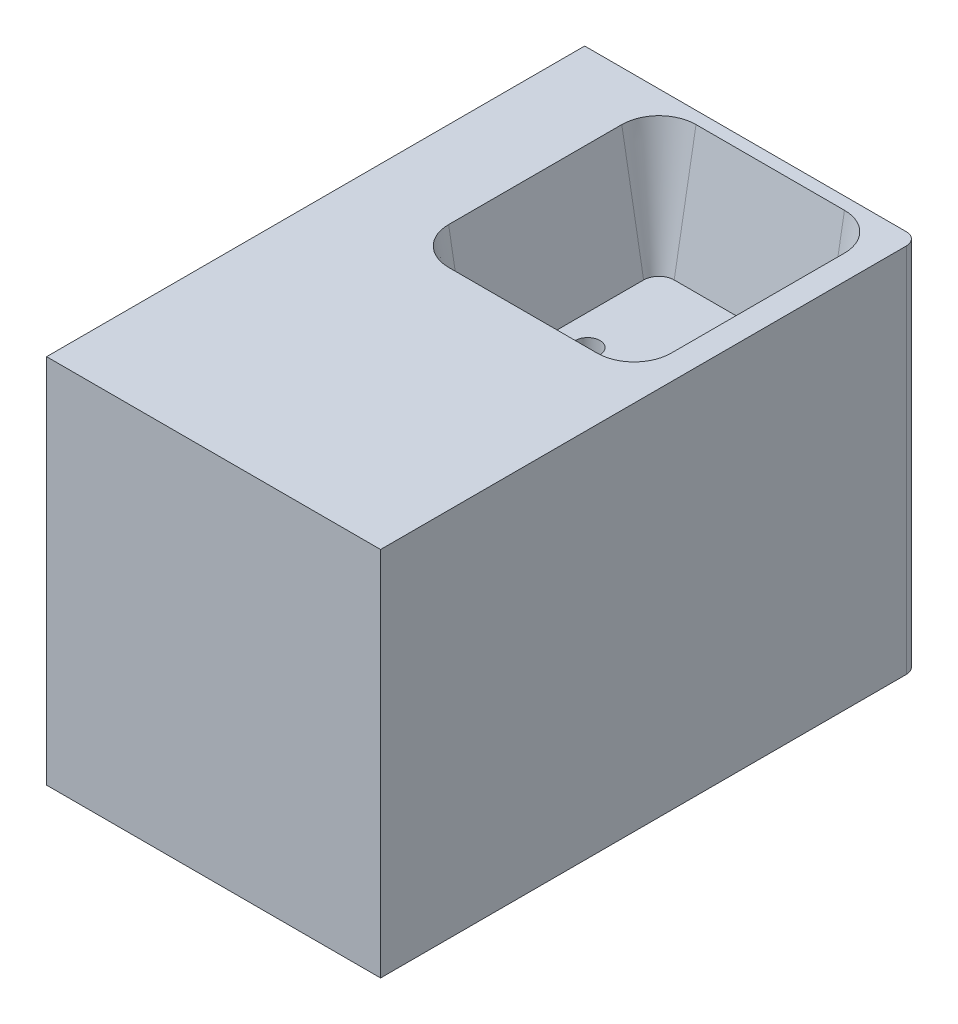
ISO-10303-21;
HEADER;
FILE_DESCRIPTION(('STEP AP214'),'2;1');
FILE_NAME('part.step','',(''),(''),'','','');
FILE_SCHEMA(('AUTOMOTIVE_DESIGN { 1 0 10303 214 1 1 1 1 }'));
ENDSEC;
DATA;
#1=APPLICATION_CONTEXT('core data for automotive mechanical design processes');
#2=APPLICATION_PROTOCOL_DEFINITION('international standard','automotive_design',2000,#1);
#3=PRODUCT_CONTEXT('',#1,'mechanical');
#4=PRODUCT('Part','Part','',(#3));
#5=PRODUCT_RELATED_PRODUCT_CATEGORY('part','',(#4));
#6=PRODUCT_DEFINITION_FORMATION('','',#4);
#7=PRODUCT_DEFINITION_CONTEXT('part definition',#1,'design');
#8=PRODUCT_DEFINITION('design','',#6,#7);
#9=PRODUCT_DEFINITION_SHAPE('','',#8);
#10=(LENGTH_UNIT() NAMED_UNIT(*) SI_UNIT(.MILLI.,.METRE.));
#11=(NAMED_UNIT(*) PLANE_ANGLE_UNIT() SI_UNIT($,.RADIAN.));
#12=(NAMED_UNIT(*) SI_UNIT($,.STERADIAN.) SOLID_ANGLE_UNIT());
#13=UNCERTAINTY_MEASURE_WITH_UNIT(LENGTH_MEASURE(1.E-05),#10,'distance_accuracy_value','');
#14=(GEOMETRIC_REPRESENTATION_CONTEXT(3) GLOBAL_UNCERTAINTY_ASSIGNED_CONTEXT((#13)) GLOBAL_UNIT_ASSIGNED_CONTEXT((#10,
#11,#12)) REPRESENTATION_CONTEXT('',''));
#15=CARTESIAN_POINT('',(0.,0.,0.));
#16=DIRECTION('',(0.,0.,1.));
#17=DIRECTION('',(1.,0.,0.));
#18=AXIS2_PLACEMENT_3D('',#15,#16,#17);
#19=CARTESIAN_POINT('',(-18.75,32.,-9.00000000000002));
#20=DIRECTION('',(0.,1.,0.));
#21=DIRECTION('',(0.,0.,1.));
#22=AXIS2_PLACEMENT_3D('',#19,#20,#21);
#23=CYLINDRICAL_SURFACE('',#22,1.);
#24=DIRECTION('',(0.,1.,0.));
#25=VECTOR('',#24,1.);
#26=CARTESIAN_POINT('',(-17.75,32.,-9.00000000000002));
#27=LINE('',#26,#25);
#28=CARTESIAN_POINT('',(-17.75,2.,-9.00000000000002));
#29=VERTEX_POINT('',#28);
#30=CARTESIAN_POINT('',(-17.75,32.,-9.00000000000002));
#31=VERTEX_POINT('',#30);
#32=EDGE_CURVE('E149',#29,#31,#27,.T.);
#33=ORIENTED_EDGE('',*,*,#32,.F.);
#34=CARTESIAN_POINT('',(-18.75,2.,-9.00000000000002));
#35=DIRECTION('',(0.,-1.,0.));
#36=DIRECTION('',(0.,0.,-1.));
#37=AXIS2_PLACEMENT_3D('',#34,#35,#36);
#38=CIRCLE('',#37,1.);
#39=CARTESIAN_POINT('',(-18.75,2.,-10.));
#40=VERTEX_POINT('',#39);
#41=EDGE_CURVE('E45',#40,#29,#38,.T.);
#42=ORIENTED_EDGE('',*,*,#41,.F.);
#43=DIRECTION('',(0.,1.,0.));
#44=VECTOR('',#43,1.);
#45=CARTESIAN_POINT('',(-18.75,32.,-10.));
#46=LINE('',#45,#44);
#47=CARTESIAN_POINT('',(-18.75,32.,-10.));
#48=VERTEX_POINT('',#47);
#49=EDGE_CURVE('E164',#48,#40,#46,.F.);
#50=ORIENTED_EDGE('',*,*,#49,.F.);
#51=CARTESIAN_POINT('',(-18.75,32.,-9.00000000000002));
#52=DIRECTION('',(0.,-1.,0.));
#53=DIRECTION('',(0.,0.,-1.));
#54=AXIS2_PLACEMENT_3D('',#51,#52,#53);
#55=CIRCLE('',#54,1.);
#56=EDGE_CURVE('E11',#31,#48,#55,.F.);
#57=ORIENTED_EDGE('',*,*,#56,.F.);
#58=EDGE_LOOP('',(#33,#42,#50,#57));
#59=FACE_BOUND('',#58,.T.);
#60=ADVANCED_FACE('F38',(#59),#23,.T.);
#61=CARTESIAN_POINT('',(-44.75,32.,60.));
#62=DIRECTION('',(1.,0.,0.));
#63=DIRECTION('',(0.,0.,-1.));
#64=AXIS2_PLACEMENT_3D('',#61,#62,#63);
#65=PLANE('',#64);
#66=DIRECTION('',(0.,-1.,0.));
#67=VECTOR('',#66,1.);
#68=CARTESIAN_POINT('',(-44.75,0.,33.5));
#69=LINE('',#68,#67);
#70=CARTESIAN_POINT('',(-44.75,32.,33.5));
#71=VERTEX_POINT('',#70);
#72=CARTESIAN_POINT('',(-44.75,2.,33.5));
#73=VERTEX_POINT('',#72);
#74=EDGE_CURVE('E128',#71,#73,#69,.T.);
#75=ORIENTED_EDGE('',*,*,#74,.F.);
#76=DIRECTION('',(0.,0.,1.));
#77=VECTOR('',#76,1.);
#78=CARTESIAN_POINT('',(-44.75,32.,60.));
#79=LINE('',#78,#77);
#80=CARTESIAN_POINT('',(-44.75,32.,-10.));
#81=VERTEX_POINT('',#80);
#82=EDGE_CURVE('E175',#81,#71,#79,.T.);
#83=ORIENTED_EDGE('',*,*,#82,.F.);
#84=DIRECTION('',(0.,-1.,0.));
#85=VECTOR('',#84,1.);
#86=CARTESIAN_POINT('',(-44.75,32.,-10.));
#87=LINE('',#86,#85);
#88=CARTESIAN_POINT('',(-44.75,2.,-10.));
#89=VERTEX_POINT('',#88);
#90=EDGE_CURVE('E154',#81,#89,#87,.T.);
#91=ORIENTED_EDGE('',*,*,#90,.T.);
#92=DIRECTION('',(0.,0.,1.));
#93=VECTOR('',#92,1.);
#94=CARTESIAN_POINT('',(-44.75,2.,60.));
#95=LINE('',#94,#93);
#96=EDGE_CURVE('E146',#89,#73,#95,.T.);
#97=ORIENTED_EDGE('',*,*,#96,.T.);
#98=EDGE_LOOP('',(#75,#83,#91,#97));
#99=FACE_BOUND('',#98,.T.);
#100=ADVANCED_FACE('F152',(#99),#65,.F.);
#101=CARTESIAN_POINT('',(-17.75,32.,60.));
#102=DIRECTION('',(-1.,0.,0.));
#103=DIRECTION('',(0.,0.,1.));
#104=AXIS2_PLACEMENT_3D('',#101,#102,#103);
#105=PLANE('',#104);
#106=DIRECTION('',(0.,0.,-1.));
#107=VECTOR('',#106,1.);
#108=CARTESIAN_POINT('',(-17.75,2.,60.));
#109=LINE('',#108,#107);
#110=CARTESIAN_POINT('',(-17.75,2.,33.5));
#111=VERTEX_POINT('',#110);
#112=EDGE_CURVE('E148',#111,#29,#109,.T.);
#113=ORIENTED_EDGE('',*,*,#112,.T.);
#114=ORIENTED_EDGE('',*,*,#32,.T.);
#115=DIRECTION('',(0.,0.,-1.));
#116=VECTOR('',#115,1.);
#117=CARTESIAN_POINT('',(-17.75,32.,60.));
#118=LINE('',#117,#116);
#119=CARTESIAN_POINT('',(-17.75,32.,33.5));
#120=VERTEX_POINT('',#119);
#121=EDGE_CURVE('E169',#120,#31,#118,.T.);
#122=ORIENTED_EDGE('',*,*,#121,.F.);
#123=DIRECTION('',(0.,-1.,0.));
#124=VECTOR('',#123,1.);
#125=CARTESIAN_POINT('',(-17.75,0.,33.5));
#126=LINE('',#125,#124);
#127=EDGE_CURVE('E155',#120,#111,#126,.T.);
#128=ORIENTED_EDGE('',*,*,#127,.T.);
#129=EDGE_LOOP('',(#113,#114,#122,#128));
#130=FACE_BOUND('',#129,.T.);
#131=ADVANCED_FACE('F168',(#130),#105,.F.);
#132=CARTESIAN_POINT('',(0.,32.,0.));
#133=DIRECTION('',(0.,-1.,0.));
#134=DIRECTION('',(0.,0.,-1.));
#135=AXIS2_PLACEMENT_3D('',#132,#133,#134);
#136=PLANE('',#135);
#137=DIRECTION('',(0.,0.,1.));
#138=VECTOR('',#137,1.);
#139=CARTESIAN_POINT('',(-37.75,32.,7.99999999999996));
#140=LINE('',#139,#138);
#141=CARTESIAN_POINT('',(-37.75,32.,-6.00000000000001));
#142=VERTEX_POINT('',#141);
#143=CARTESIAN_POINT('',(-37.75,32.,7.99999999999996));
#144=VERTEX_POINT('',#143);
#145=EDGE_CURVE('E225',#142,#144,#140,.T.);
#146=ORIENTED_EDGE('',*,*,#145,.F.);
#147=CARTESIAN_POINT('',(-34.75,32.,-6.00000000000002));
#148=DIRECTION('',(0.,1.,0.));
#149=DIRECTION('',(0.,0.,1.));
#150=AXIS2_PLACEMENT_3D('',#147,#148,#149);
#151=CIRCLE('',#150,3.);
#152=CARTESIAN_POINT('',(-34.75,32.,-9.00000000000002));
#153=VERTEX_POINT('',#152);
#154=EDGE_CURVE('E176',#153,#142,#151,.T.);
#155=ORIENTED_EDGE('',*,*,#154,.F.);
#156=DIRECTION('',(-1.,0.,0.));
#157=VECTOR('',#156,1.);
#158=CARTESIAN_POINT('',(-34.75,32.,-9.00000000000002));
#159=LINE('',#158,#157);
#160=CARTESIAN_POINT('',(-22.75,32.,-9.00000000000002));
#161=VERTEX_POINT('',#160);
#162=EDGE_CURVE('E210',#161,#153,#159,.T.);
#163=ORIENTED_EDGE('',*,*,#162,.F.);
#164=CARTESIAN_POINT('',(-22.75,32.,-6.00000000000002));
#165=DIRECTION('',(0.,1.,0.));
#166=DIRECTION('',(0.,0.,1.));
#167=AXIS2_PLACEMENT_3D('',#164,#165,#166);
#168=CIRCLE('',#167,3.);
#169=CARTESIAN_POINT('',(-19.75,32.,-6.));
#170=VERTEX_POINT('',#169);
#171=EDGE_CURVE('E209',#170,#161,#168,.T.);
#172=ORIENTED_EDGE('',*,*,#171,.F.);
#173=DIRECTION('',(0.,0.,-1.));
#174=VECTOR('',#173,1.);
#175=CARTESIAN_POINT('',(-19.75,32.,7.99999999999996));
#176=LINE('',#175,#174);
#177=CARTESIAN_POINT('',(-19.75,32.,7.99999999999996));
#178=VERTEX_POINT('',#177);
#179=EDGE_CURVE('E213',#178,#170,#176,.T.);
#180=ORIENTED_EDGE('',*,*,#179,.F.);
#181=CARTESIAN_POINT('',(-22.75,32.,7.99999999999998));
#182=DIRECTION('',(0.,1.,0.));
#183=DIRECTION('',(0.,0.,-1.));
#184=AXIS2_PLACEMENT_3D('',#181,#182,#183);
#185=CIRCLE('',#184,3.);
#186=CARTESIAN_POINT('',(-22.75,32.,11.));
#187=VERTEX_POINT('',#186);
#188=EDGE_CURVE('E216',#187,#178,#185,.T.);
#189=ORIENTED_EDGE('',*,*,#188,.F.);
#190=DIRECTION('',(1.,0.,0.));
#191=VECTOR('',#190,1.);
#192=CARTESIAN_POINT('',(-34.75,32.,11.));
#193=LINE('',#192,#191);
#194=CARTESIAN_POINT('',(-34.75,32.,11.));
#195=VERTEX_POINT('',#194);
#196=EDGE_CURVE('E219',#195,#187,#193,.T.);
#197=ORIENTED_EDGE('',*,*,#196,.F.);
#198=CARTESIAN_POINT('',(-34.75,32.,7.99999999999998));
#199=DIRECTION('',(0.,1.,0.));
#200=DIRECTION('',(0.,0.,-1.));
#201=AXIS2_PLACEMENT_3D('',#198,#199,#200);
#202=CIRCLE('',#201,3.);
#203=EDGE_CURVE('E222',#144,#195,#202,.T.);
#204=ORIENTED_EDGE('',*,*,#203,.F.);
#205=EDGE_LOOP('',(#146,#155,#163,#172,#180,#189,#197,#204));
#206=FACE_BOUND('',#205,.T.);
#207=ORIENTED_EDGE('',*,*,#121,.T.);
#208=ORIENTED_EDGE('',*,*,#56,.T.);
#209=DIRECTION('',(-1.,0.,0.));
#210=VECTOR('',#209,1.);
#211=CARTESIAN_POINT('',(-44.75,32.,-10.));
#212=LINE('',#211,#210);
#213=EDGE_CURVE('E171',#48,#81,#212,.T.);
#214=ORIENTED_EDGE('',*,*,#213,.T.);
#215=ORIENTED_EDGE('',*,*,#82,.T.);
#216=DIRECTION('',(1.,0.,0.));
#217=VECTOR('',#216,1.);
#218=CARTESIAN_POINT('',(-74.754166377355,32.,33.5));
#219=LINE('',#218,#217);
#220=EDGE_CURVE('E134',#71,#120,#219,.T.);
#221=ORIENTED_EDGE('',*,*,#220,.T.);
#222=EDGE_LOOP('',(#207,#208,#214,#215,#221));
#223=FACE_BOUND('',#222,.T.);
#224=ADVANCED_FACE('F271',(#206,#223),#136,.F.);
#225=CARTESIAN_POINT('',(0.,2.,0.));
#226=DIRECTION('',(0.,-1.,0.));
#227=DIRECTION('',(0.,0.,-1.));
#228=AXIS2_PLACEMENT_3D('',#225,#226,#227);
#229=PLANE('',#228);
#230=DIRECTION('',(-1.,0.,0.));
#231=VECTOR('',#230,1.);
#232=CARTESIAN_POINT('',(-44.75,2.,-10.));
#233=LINE('',#232,#231);
#234=EDGE_CURVE('E165',#40,#89,#233,.T.);
#235=ORIENTED_EDGE('',*,*,#234,.F.);
#236=ORIENTED_EDGE('',*,*,#41,.T.);
#237=ORIENTED_EDGE('',*,*,#112,.F.);
#238=DIRECTION('',(1.,0.,0.));
#239=VECTOR('',#238,1.);
#240=CARTESIAN_POINT('',(-74.754166377355,2.,33.5));
#241=LINE('',#240,#239);
#242=EDGE_CURVE('E131',#73,#111,#241,.T.);
#243=ORIENTED_EDGE('',*,*,#242,.F.);
#244=ORIENTED_EDGE('',*,*,#96,.F.);
#245=EDGE_LOOP('',(#235,#236,#237,#243,#244));
#246=FACE_BOUND('',#245,.T.);
#247=ADVANCED_FACE('F145',(#246),#229,.T.);
#248=CARTESIAN_POINT('',(-44.75,32.,-10.));
#249=DIRECTION('',(0.,0.,1.));
#250=DIRECTION('',(1.,0.,0.));
#251=AXIS2_PLACEMENT_3D('',#248,#249,#250);
#252=PLANE('',#251);
#253=ORIENTED_EDGE('',*,*,#213,.F.);
#254=ORIENTED_EDGE('',*,*,#49,.T.);
#255=ORIENTED_EDGE('',*,*,#234,.T.);
#256=ORIENTED_EDGE('',*,*,#90,.F.);
#257=EDGE_LOOP('',(#253,#254,#255,#256));
#258=FACE_BOUND('',#257,.T.);
#259=ADVANCED_FACE('F276',(#258),#252,.F.);
#260=CARTESIAN_POINT('',(-34.75,32.,-6.00000000000002));
#261=DIRECTION('',(0.,1.,0.));
#262=DIRECTION('',(0.,0.,1.));
#263=AXIS2_PLACEMENT_3D('',#260,#261,#262);
#264=CONICAL_SURFACE('',#263,3.,0.174532925199433);
#265=ORIENTED_EDGE('',*,*,#154,.T.);
#266=DIRECTION('',(-0.173648177666931,0.984807753012208,0.));
#267=VECTOR('',#266,1.);
#268=CARTESIAN_POINT('',(-37.75,32.,-6.));
#269=LINE('',#268,#267);
#270=CARTESIAN_POINT('',(-35.9867301929154,22.,-6.00000000000001));
#271=VERTEX_POINT('',#270);
#272=EDGE_CURVE('E206',#271,#142,#269,.T.);
#273=ORIENTED_EDGE('',*,*,#272,.F.);
#274=CARTESIAN_POINT('',(-34.75,22.,-6.00000000000002));
#275=DIRECTION('',(0.,1.,0.));
#276=DIRECTION('',(0.,0.,1.));
#277=AXIS2_PLACEMENT_3D('',#274,#275,#276);
#278=CIRCLE('',#277,1.23673019291535);
#279=CARTESIAN_POINT('',(-34.75,22.,-7.23673019291537));
#280=VERTEX_POINT('',#279);
#281=EDGE_CURVE('E185',#280,#271,#278,.T.);
#282=ORIENTED_EDGE('',*,*,#281,.F.);
#283=DIRECTION('',(0.,0.984807753012208,-0.173648177666931));
#284=VECTOR('',#283,1.);
#285=CARTESIAN_POINT('',(-34.75,32.,-9.00000000000002));
#286=LINE('',#285,#284);
#287=EDGE_CURVE('E228',#280,#153,#286,.T.);
#288=ORIENTED_EDGE('',*,*,#287,.T.);
#289=EDGE_LOOP('',(#265,#273,#282,#288));
#290=FACE_BOUND('',#289,.T.);
#291=ADVANCED_FACE('F378',(#290),#264,.F.);
#292=CARTESIAN_POINT('',(-34.75,32.,-9.00000000000002));
#293=DIRECTION('',(0.,-0.173648177666931,-0.984807753012208));
#294=DIRECTION('',(0.,0.984807753012208,-0.173648177666931));
#295=AXIS2_PLACEMENT_3D('',#292,#293,#294);
#296=PLANE('',#295);
#297=ORIENTED_EDGE('',*,*,#162,.T.);
#298=ORIENTED_EDGE('',*,*,#287,.F.);
#299=DIRECTION('',(-1.,0.,0.));
#300=VECTOR('',#299,1.);
#301=CARTESIAN_POINT('',(-34.75,22.,-7.23673019291537));
#302=LINE('',#301,#300);
#303=CARTESIAN_POINT('',(-22.75,22.,-7.23673019291537));
#304=VERTEX_POINT('',#303);
#305=EDGE_CURVE('E200',#304,#280,#302,.T.);
#306=ORIENTED_EDGE('',*,*,#305,.F.);
#307=DIRECTION('',(0.,0.984807753012208,-0.173648177666931));
#308=VECTOR('',#307,1.);
#309=CARTESIAN_POINT('',(-22.75,32.,-9.00000000000002));
#310=LINE('',#309,#308);
#311=EDGE_CURVE('E207',#304,#161,#310,.T.);
#312=ORIENTED_EDGE('',*,*,#311,.T.);
#313=EDGE_LOOP('',(#297,#298,#306,#312));
#314=FACE_BOUND('',#313,.T.);
#315=ADVANCED_FACE('F367',(#314),#296,.F.);
#316=CARTESIAN_POINT('',(-22.75,32.,-6.00000000000002));
#317=DIRECTION('',(0.,1.,0.));
#318=DIRECTION('',(0.,0.,1.));
#319=AXIS2_PLACEMENT_3D('',#316,#317,#318);
#320=CONICAL_SURFACE('',#319,3.,0.174532925199433);
#321=ORIENTED_EDGE('',*,*,#171,.T.);
#322=ORIENTED_EDGE('',*,*,#311,.F.);
#323=CARTESIAN_POINT('',(-22.75,22.,-6.00000000000002));
#324=DIRECTION('',(0.,1.,0.));
#325=DIRECTION('',(0.,0.,1.));
#326=AXIS2_PLACEMENT_3D('',#323,#324,#325);
#327=CIRCLE('',#326,1.23673019291535);
#328=CARTESIAN_POINT('',(-21.5132698070847,22.,-6.));
#329=VERTEX_POINT('',#328);
#330=EDGE_CURVE('E197',#329,#304,#327,.T.);
#331=ORIENTED_EDGE('',*,*,#330,.F.);
#332=DIRECTION('',(0.173648177666931,0.984807753012208,0.));
#333=VECTOR('',#332,1.);
#334=CARTESIAN_POINT('',(-19.75,32.,-6.));
#335=LINE('',#334,#333);
#336=EDGE_CURVE('E211',#329,#170,#335,.T.);
#337=ORIENTED_EDGE('',*,*,#336,.T.);
#338=EDGE_LOOP('',(#321,#322,#331,#337));
#339=FACE_BOUND('',#338,.T.);
#340=ADVANCED_FACE('F356',(#339),#320,.F.);
#341=CARTESIAN_POINT('',(-19.75,32.,7.99999999999996));
#342=DIRECTION('',(0.984807753012208,-0.173648177666931,0.));
#343=DIRECTION('',(0.173648177666931,0.984807753012208,0.));
#344=AXIS2_PLACEMENT_3D('',#341,#342,#343);
#345=PLANE('',#344);
#346=ORIENTED_EDGE('',*,*,#179,.T.);
#347=ORIENTED_EDGE('',*,*,#336,.F.);
#348=DIRECTION('',(0.,0.,-1.));
#349=VECTOR('',#348,1.);
#350=CARTESIAN_POINT('',(-21.5132698070847,22.,-6.00000000000002));
#351=LINE('',#350,#349);
#352=CARTESIAN_POINT('',(-21.5132698070847,22.,7.99999999999997));
#353=VERTEX_POINT('',#352);
#354=EDGE_CURVE('E194',#353,#329,#351,.T.);
#355=ORIENTED_EDGE('',*,*,#354,.F.);
#356=DIRECTION('',(0.173648177666931,0.984807753012208,0.));
#357=VECTOR('',#356,1.);
#358=CARTESIAN_POINT('',(-19.75,32.,7.99999999999996));
#359=LINE('',#358,#357);
#360=EDGE_CURVE('E214',#353,#178,#359,.T.);
#361=ORIENTED_EDGE('',*,*,#360,.T.);
#362=EDGE_LOOP('',(#346,#347,#355,#361));
#363=FACE_BOUND('',#362,.T.);
#364=ADVANCED_FACE('F345',(#363),#345,.F.);
#365=CARTESIAN_POINT('',(-22.75,32.,7.99999999999998));
#366=DIRECTION('',(0.,1.,0.));
#367=DIRECTION('',(0.,0.,-1.));
#368=AXIS2_PLACEMENT_3D('',#365,#366,#367);
#369=CONICAL_SURFACE('',#368,3.,0.174532925199433);
#370=ORIENTED_EDGE('',*,*,#188,.T.);
#371=ORIENTED_EDGE('',*,*,#360,.F.);
#372=CARTESIAN_POINT('',(-22.75,22.,7.99999999999998));
#373=DIRECTION('',(0.,1.,0.));
#374=DIRECTION('',(0.,0.,1.));
#375=AXIS2_PLACEMENT_3D('',#372,#373,#374);
#376=CIRCLE('',#375,1.23673019291535);
#377=CARTESIAN_POINT('',(-22.75,22.,9.23673019291532));
#378=VERTEX_POINT('',#377);
#379=EDGE_CURVE('E191',#378,#353,#376,.T.);
#380=ORIENTED_EDGE('',*,*,#379,.F.);
#381=DIRECTION('',(0.,0.984807753012208,0.173648177666931));
#382=VECTOR('',#381,1.);
#383=CARTESIAN_POINT('',(-22.75,32.,11.));
#384=LINE('',#383,#382);
#385=EDGE_CURVE('E217',#378,#187,#384,.T.);
#386=ORIENTED_EDGE('',*,*,#385,.T.);
#387=EDGE_LOOP('',(#370,#371,#380,#386));
#388=FACE_BOUND('',#387,.T.);
#389=ADVANCED_FACE('F334',(#388),#369,.F.);
#390=CARTESIAN_POINT('',(-34.75,32.,11.));
#391=DIRECTION('',(0.,-0.173648177666931,0.984807753012208));
#392=DIRECTION('',(0.,-0.984807753012208,-0.173648177666931));
#393=AXIS2_PLACEMENT_3D('',#390,#391,#392);
#394=PLANE('',#393);
#395=ORIENTED_EDGE('',*,*,#196,.T.);
#396=ORIENTED_EDGE('',*,*,#385,.F.);
#397=DIRECTION('',(1.,0.,0.));
#398=VECTOR('',#397,1.);
#399=CARTESIAN_POINT('',(-34.75,22.,9.23673019291532));
#400=LINE('',#399,#398);
#401=CARTESIAN_POINT('',(-34.75,22.,9.23673019291533));
#402=VERTEX_POINT('',#401);
#403=EDGE_CURVE('E188',#402,#378,#400,.T.);
#404=ORIENTED_EDGE('',*,*,#403,.F.);
#405=DIRECTION('',(0.,0.984807753012208,0.173648177666931));
#406=VECTOR('',#405,1.);
#407=CARTESIAN_POINT('',(-34.75,32.,11.));
#408=LINE('',#407,#406);
#409=EDGE_CURVE('E220',#402,#195,#408,.T.);
#410=ORIENTED_EDGE('',*,*,#409,.T.);
#411=EDGE_LOOP('',(#395,#396,#404,#410));
#412=FACE_BOUND('',#411,.T.);
#413=ADVANCED_FACE('F323',(#412),#394,.F.);
#414=CARTESIAN_POINT('',(-34.75,32.,7.99999999999998));
#415=DIRECTION('',(0.,1.,0.));
#416=DIRECTION('',(0.,0.,-1.));
#417=AXIS2_PLACEMENT_3D('',#414,#415,#416);
#418=CONICAL_SURFACE('',#417,3.,0.174532925199433);
#419=ORIENTED_EDGE('',*,*,#203,.T.);
#420=ORIENTED_EDGE('',*,*,#409,.F.);
#421=CARTESIAN_POINT('',(-34.75,22.,7.99999999999998));
#422=DIRECTION('',(0.,1.,0.));
#423=DIRECTION('',(0.,0.,1.));
#424=AXIS2_PLACEMENT_3D('',#421,#422,#423);
#425=CIRCLE('',#424,1.23673019291535);
#426=CARTESIAN_POINT('',(-35.9867301929154,22.,7.99999999999996));
#427=VERTEX_POINT('',#426);
#428=EDGE_CURVE('E184',#427,#402,#425,.T.);
#429=ORIENTED_EDGE('',*,*,#428,.F.);
#430=DIRECTION('',(-0.173648177666931,0.984807753012208,0.));
#431=VECTOR('',#430,1.);
#432=CARTESIAN_POINT('',(-37.75,32.,7.99999999999996));
#433=LINE('',#432,#431);
#434=EDGE_CURVE('E223',#427,#144,#433,.T.);
#435=ORIENTED_EDGE('',*,*,#434,.T.);
#436=EDGE_LOOP('',(#419,#420,#429,#435));
#437=FACE_BOUND('',#436,.T.);
#438=ADVANCED_FACE('F312',(#437),#418,.F.);
#439=CARTESIAN_POINT('',(-37.75,32.,7.99999999999996));
#440=DIRECTION('',(-0.984807753012208,-0.173648177666931,0.));
#441=DIRECTION('',(0.173648177666931,-0.984807753012208,0.));
#442=AXIS2_PLACEMENT_3D('',#439,#440,#441);
#443=PLANE('',#442);
#444=ORIENTED_EDGE('',*,*,#145,.T.);
#445=ORIENTED_EDGE('',*,*,#434,.F.);
#446=DIRECTION('',(0.,0.,1.));
#447=VECTOR('',#446,1.);
#448=CARTESIAN_POINT('',(-35.9867301929154,22.,-6.00000000000002));
#449=LINE('',#448,#447);
#450=EDGE_CURVE('E181',#271,#427,#449,.T.);
#451=ORIENTED_EDGE('',*,*,#450,.F.);
#452=ORIENTED_EDGE('',*,*,#272,.T.);
#453=EDGE_LOOP('',(#444,#445,#451,#452));
#454=FACE_BOUND('',#453,.T.);
#455=ADVANCED_FACE('F261',(#454),#443,.F.);
#456=CARTESIAN_POINT('',(-34.75,22.,-6.00000000000002));
#457=DIRECTION('',(0.,1.,0.));
#458=DIRECTION('',(0.,0.,1.));
#459=AXIS2_PLACEMENT_3D('',#456,#457,#458);
#460=PLANE('',#459);
#461=CARTESIAN_POINT('',(-33.5132698070847,22.,0.999999999999972));
#462=DIRECTION('',(0.,1.,0.));
#463=DIRECTION('',(0.,0.,1.));
#464=AXIS2_PLACEMENT_3D('',#461,#462,#463);
#465=CIRCLE('',#464,0.999999999999998);
#466=CARTESIAN_POINT('',(-33.5132698070847,22.,1.99999999999997));
#467=VERTEX_POINT('',#466);
#468=EDGE_CURVE('E203',#467,#467,#465,.T.);
#469=ORIENTED_EDGE('',*,*,#468,.F.);
#470=EDGE_LOOP('',(#469));
#471=FACE_BOUND('',#470,.T.);
#472=ORIENTED_EDGE('',*,*,#281,.T.);
#473=ORIENTED_EDGE('',*,*,#450,.T.);
#474=ORIENTED_EDGE('',*,*,#428,.T.);
#475=ORIENTED_EDGE('',*,*,#403,.T.);
#476=ORIENTED_EDGE('',*,*,#379,.T.);
#477=ORIENTED_EDGE('',*,*,#354,.T.);
#478=ORIENTED_EDGE('',*,*,#330,.T.);
#479=ORIENTED_EDGE('',*,*,#305,.T.);
#480=EDGE_LOOP('',(#472,#473,#474,#475,#476,#477,#478,#479));
#481=FACE_BOUND('',#480,.T.);
#482=ADVANCED_FACE('F254',(#471,#481),#460,.T.);
#483=CARTESIAN_POINT('',(-33.5132698070847,12.,0.999999999999972));
#484=DIRECTION('',(0.,1.,0.));
#485=DIRECTION('',(0.,0.,1.));
#486=AXIS2_PLACEMENT_3D('',#483,#484,#485);
#487=CYLINDRICAL_SURFACE('',#486,0.999999999999998);
#488=CARTESIAN_POINT('',(-33.5132698070847,12.,0.999999999999972));
#489=DIRECTION('',(0.,1.,0.));
#490=DIRECTION('',(0.,0.,1.));
#491=AXIS2_PLACEMENT_3D('',#488,#489,#490);
#492=CIRCLE('',#491,0.999999999999998);
#493=CARTESIAN_POINT('',(-33.5132698070847,12.,1.99999999999997));
#494=VERTEX_POINT('',#493);
#495=EDGE_CURVE('E139',#494,#494,#492,.T.);
#496=ORIENTED_EDGE('',*,*,#495,.F.);
#497=EDGE_LOOP('',(#496));
#498=FACE_BOUND('',#497,.T.);
#499=ORIENTED_EDGE('',*,*,#468,.T.);
#500=EDGE_LOOP('',(#499));
#501=FACE_BOUND('',#500,.T.);
#502=ADVANCED_FACE('F252',(#498,#501),#487,.F.);
#503=CARTESIAN_POINT('',(-33.5132698070847,12.,0.999999999999972));
#504=DIRECTION('',(0.,1.,0.));
#505=DIRECTION('',(0.,0.,1.));
#506=AXIS2_PLACEMENT_3D('',#503,#504,#505);
#507=PLANE('',#506);
#508=ORIENTED_EDGE('',*,*,#495,.T.);
#509=EDGE_LOOP('',(#508));
#510=FACE_BOUND('',#509,.T.);
#511=ADVANCED_FACE('F250',(#510),#507,.T.);
#512=CARTESIAN_POINT('',(-74.754166377355,0.,33.5));
#513=DIRECTION('',(0.,0.,1.));
#514=DIRECTION('',(1.,0.,0.));
#515=AXIS2_PLACEMENT_3D('',#512,#513,#514);
#516=PLANE('',#515);
#517=ORIENTED_EDGE('',*,*,#74,.T.);
#518=ORIENTED_EDGE('',*,*,#242,.T.);
#519=ORIENTED_EDGE('',*,*,#127,.F.);
#520=ORIENTED_EDGE('',*,*,#220,.F.);
#521=EDGE_LOOP('',(#517,#518,#519,#520));
#522=FACE_BOUND('',#521,.T.);
#523=ADVANCED_FACE('F130',(#522),#516,.T.);
#524=CLOSED_SHELL('',(#60,#100,#131,#224,#247,#259,#291,#315,#340,#364,#389,#413,#438,#455,#482,
#502,#511,#523));
#525=MANIFOLD_SOLID_BREP('B2',#524);
#526=ADVANCED_BREP_SHAPE_REPRESENTATION('',(#18,#525),#14);
#527=SHAPE_DEFINITION_REPRESENTATION(#9,#526);
ENDSEC;
END-ISO-10303-21;
